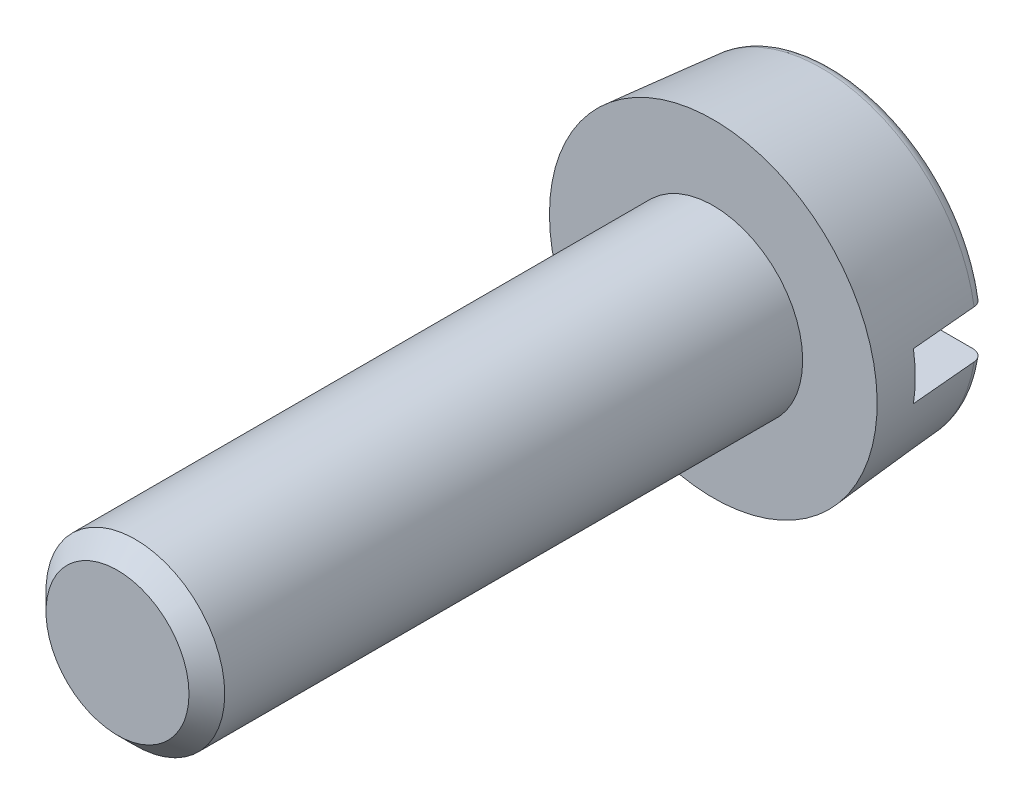
ISO-10303-21;
HEADER;
FILE_DESCRIPTION(('STEP AP214'),'2;1');
FILE_NAME('part.step','',(''),(''),'','','');
FILE_SCHEMA(('AUTOMOTIVE_DESIGN { 1 0 10303 214 1 1 1 1 }'));
ENDSEC;
DATA;
#1=APPLICATION_CONTEXT('core data for automotive mechanical design processes');
#2=APPLICATION_PROTOCOL_DEFINITION('international standard','automotive_design',2000,#1);
#3=PRODUCT_CONTEXT('',#1,'mechanical');
#4=PRODUCT('Part','Part','',(#3));
#5=PRODUCT_RELATED_PRODUCT_CATEGORY('part','',(#4));
#6=PRODUCT_DEFINITION_FORMATION('','',#4);
#7=PRODUCT_DEFINITION_CONTEXT('part definition',#1,'design');
#8=PRODUCT_DEFINITION('design','',#6,#7);
#9=PRODUCT_DEFINITION_SHAPE('','',#8);
#10=(LENGTH_UNIT() NAMED_UNIT(*) SI_UNIT(.MILLI.,.METRE.));
#11=(NAMED_UNIT(*) PLANE_ANGLE_UNIT() SI_UNIT($,.RADIAN.));
#12=(NAMED_UNIT(*) SI_UNIT($,.STERADIAN.) SOLID_ANGLE_UNIT());
#13=UNCERTAINTY_MEASURE_WITH_UNIT(LENGTH_MEASURE(1.E-05),#10,'distance_accuracy_value','');
#14=(GEOMETRIC_REPRESENTATION_CONTEXT(3) GLOBAL_UNCERTAINTY_ASSIGNED_CONTEXT((#13)) GLOBAL_UNIT_ASSIGNED_CONTEXT((#10,
#11,#12)) REPRESENTATION_CONTEXT('',''));
#15=CARTESIAN_POINT('',(0.,0.,0.));
#16=DIRECTION('',(0.,0.,1.));
#17=DIRECTION('',(1.,0.,0.));
#18=AXIS2_PLACEMENT_3D('',#15,#16,#17);
#19=CARTESIAN_POINT('',(0.,0.,-2.));
#20=DIRECTION('',(0.,0.,1.));
#21=DIRECTION('',(1.,0.,0.));
#22=AXIS2_PLACEMENT_3D('',#19,#20,#21);
#23=PLANE('',#22);
#24=DIRECTION('',(1.,0.,0.));
#25=VECTOR('',#24,1.);
#26=CARTESIAN_POINT('',(-2.75,-0.4,-2.));
#27=LINE('',#26,#25);
#28=CARTESIAN_POINT('',(-2.35807100389417,-0.4,-2.));
#29=VERTEX_POINT('',#28);
#30=CARTESIAN_POINT('',(2.35807100389417,-0.4,-2.));
#31=VERTEX_POINT('',#30);
#32=EDGE_CURVE('E179',#29,#31,#27,.T.);
#33=ORIENTED_EDGE('',*,*,#32,.T.);
#34=CARTESIAN_POINT('',(0.,0.,-2.));
#35=DIRECTION('',(0.,0.,-1.));
#36=DIRECTION('',(-1.,0.,0.));
#37=AXIS2_PLACEMENT_3D('',#34,#35,#36);
#38=CIRCLE('',#37,2.39175643814467);
#39=EDGE_CURVE('E111',#31,#29,#38,.T.);
#40=ORIENTED_EDGE('',*,*,#39,.T.);
#41=EDGE_LOOP('',(#33,#40));
#42=FACE_BOUND('',#41,.T.);
#43=ADVANCED_FACE('F30',(#42),#23,.F.);
#44=DIRECTION('',(-1.,0.,0.));
#45=VECTOR('',#44,1.);
#46=CARTESIAN_POINT('',(-2.75,0.4,-2.));
#47=LINE('',#46,#45);
#48=CARTESIAN_POINT('',(2.35807100389417,0.4,-2.));
#49=VERTEX_POINT('',#48);
#50=CARTESIAN_POINT('',(-2.35807100389417,0.4,-2.));
#51=VERTEX_POINT('',#50);
#52=EDGE_CURVE('E96',#49,#51,#47,.T.);
#53=ORIENTED_EDGE('',*,*,#52,.T.);
#54=EDGE_CURVE('E108',#51,#49,#38,.T.);
#55=ORIENTED_EDGE('',*,*,#54,.T.);
#56=EDGE_LOOP('',(#53,#55));
#57=FACE_BOUND('',#56,.T.);
#58=ADVANCED_FACE('F173',(#57),#23,.F.);
#59=CARTESIAN_POINT('',(0.,0.,-1.8));
#60=DIRECTION('',(0.,0.,-1.));
#61=DIRECTION('',(-1.,0.,0.));
#62=AXIS2_PLACEMENT_3D('',#59,#60,#61);
#63=TOROIDAL_SURFACE('',#62,2.39175643814467,0.200000000000001);
#64=CARTESIAN_POINT('',(-2.52204813185839,-0.4,-1.91754116486601));
#65=CARTESIAN_POINT('',(-2.52865775890514,-0.4,-1.90855344162095));
#66=CARTESIAN_POINT('',(-2.53451810160674,-0.4,-1.89900530046316));
#67=CARTESIAN_POINT('',(-2.54455984275685,-0.4,-1.879054234523));
#68=CARTESIAN_POINT('',(-2.54873943790926,-0.4,-1.86865040599647));
#69=CARTESIAN_POINT('',(-2.55528754435603,-0.4,-1.84728807143898));
#70=CARTESIAN_POINT('',(-2.55765633550847,-0.4,-1.83632965139886));
#71=CARTESIAN_POINT('',(-2.56051050201393,-0.4,-1.81417286827281));
#72=CARTESIAN_POINT('',(-2.56099631791475,-0.4,-1.80297456192815));
#73=CARTESIAN_POINT('',(-2.56007317871069,-0.4,-1.78070501289132));
#74=CARTESIAN_POINT('',(-2.55867240657824,-0.4,-1.76963343016532));
#75=CARTESIAN_POINT('',(-2.55403281847354,-0.4,-1.74788225633687));
#76=CARTESIAN_POINT('',(-2.5507939554008,-0.4,-1.73720267528681));
#77=CARTESIAN_POINT('',(-2.54257296593889,-0.4,-1.71652996254586));
#78=CARTESIAN_POINT('',(-2.53758979082597,-0.4,-1.70653724814993));
#79=CARTESIAN_POINT('',(-2.52602836206606,-0.4,-1.68752204377932));
#80=CARTESIAN_POINT('',(-2.51945006472148,-0.4,-1.67849958039396));
#81=CARTESIAN_POINT('',(-2.50483555924673,-0.4,-1.6616069051437));
#82=CARTESIAN_POINT('',(-2.49678887455698,-0.4,-1.65374575962527));
#83=CARTESIAN_POINT('',(-2.47950341410387,-0.4,-1.63946702273388));
#84=CARTESIAN_POINT('',(-2.47026457222365,-0.4,-1.63304951147886));
#85=CARTESIAN_POINT('',(-2.45074120101458,-0.4,-1.62175902781981));
#86=CARTESIAN_POINT('',(-2.44044563631788,-0.4,-1.6169051390523));
#87=CARTESIAN_POINT('',(-2.4191923144838,-0.4,-1.60897149727182));
#88=CARTESIAN_POINT('',(-2.40823451242438,-0.4,-1.60589186476291));
#89=CARTESIAN_POINT('',(-2.38582753572817,-0.4,-1.60155798712168));
#90=CARTESIAN_POINT('',(-2.37437405331689,-0.4,-1.60032600072377));
#91=CARTESIAN_POINT('',(-2.35142171216814,-0.4,-1.59978725729211));
#92=CARTESIAN_POINT('',(-2.33992285111357,-0.4,-1.60048059987327));
#93=CARTESIAN_POINT('',(-2.31711871792309,-0.4,-1.60378458593551));
#94=CARTESIAN_POINT('',(-2.30581544239984,-0.4,-1.60640903344652));
#95=CARTESIAN_POINT('',(-2.28381048661826,-0.4,-1.61352076771892));
#96=CARTESIAN_POINT('',(-2.27310881239486,-0.4,-1.61800807316365));
#97=CARTESIAN_POINT('',(-2.25263145108845,-0.4,-1.62871787324017));
#98=CARTESIAN_POINT('',(-2.24285443091869,-0.4,-1.63493781719781));
#99=CARTESIAN_POINT('',(-2.22449793490009,-0.4,-1.64894755269323));
#100=CARTESIAN_POINT('',(-2.21591840028723,-0.4,-1.65673726715201));
#101=CARTESIAN_POINT('',(-2.20030322071626,-0.4,-1.6735788600478));
#102=CARTESIAN_POINT('',(-2.19325192299053,-0.4,-1.68261622012687));
#103=CARTESIAN_POINT('',(-2.18079547364819,-0.4,-1.70176218098242));
#104=CARTESIAN_POINT('',(-2.17539017097947,-0.4,-1.71187068334591));
#105=CARTESIAN_POINT('',(-2.1664690938285,-0.4,-1.73270099567748));
#106=CARTESIAN_POINT('',(-2.16292487816789,-0.4,-1.74341062660618));
#107=CARTESIAN_POINT('',(-2.15771089941273,-0.4,-1.76527672253501));
#108=CARTESIAN_POINT('',(-2.15604097867979,-0.4,-1.77643314987539));
#109=CARTESIAN_POINT('',(-2.15463824669613,-0.4,-1.79872411828803));
#110=CARTESIAN_POINT('',(-2.15488106401967,-0.4,-1.80985713244257));
#111=CARTESIAN_POINT('',(-2.15723810468913,-0.4,-1.83192290746165));
#112=CARTESIAN_POINT('',(-2.1593522731258,-0.4,-1.84285567419225));
#113=CARTESIAN_POINT('',(-2.16537723833754,-0.4,-1.8641820194607));
#114=CARTESIAN_POINT('',(-2.16928319744312,-0.4,-1.87457696649836));
#115=CARTESIAN_POINT('',(-2.17877018628115,-0.4,-1.89457162214626));
#116=CARTESIAN_POINT('',(-2.18435127178943,-0.4,-1.90417130426341));
#117=CARTESIAN_POINT('',(-2.19707738847665,-0.4,-1.92239559142899));
#118=CARTESIAN_POINT('',(-2.20423561568046,-0.4,-1.9310109772614));
#119=CARTESIAN_POINT('',(-2.21987715075783,-0.4,-1.9469402537394));
#120=CARTESIAN_POINT('',(-2.22836056116485,-0.4,-1.95425404358277));
#121=CARTESIAN_POINT('',(-2.24654950034134,-0.4,-1.96749109107626));
#122=CARTESIAN_POINT('',(-2.25627166684992,-0.4,-1.97339148680604));
#123=CARTESIAN_POINT('',(-2.27655814858367,-0.4,-1.98350262351568));
#124=CARTESIAN_POINT('',(-2.28712253199782,-0.4,-1.98771322751692));
#125=CARTESIAN_POINT('',(-2.30895280047345,-0.4,-1.99438290790571));
#126=CARTESIAN_POINT('',(-2.32022643857178,-0.4,-1.99681662549374));
#127=CARTESIAN_POINT('',(-2.34302147767776,-0.4,-1.99977047768632));
#128=CARTESIAN_POINT('',(-2.35454288099767,-0.4,-2.00029059442448));
#129=CARTESIAN_POINT('',(-2.37758492986869,-0.4,-1.9993987641218));
#130=CARTESIAN_POINT('',(-2.38910509934491,-0.4,-1.99797443961617));
#131=CARTESIAN_POINT('',(-2.41174453190155,-0.4,-1.99320565553102));
#132=CARTESIAN_POINT('',(-2.42286369691932,-0.4,-1.9898607296215));
#133=CARTESIAN_POINT('',(-2.44434826142107,-0.4,-1.98134934163125));
#134=CARTESIAN_POINT('',(-2.45471549647035,-0.4,-1.97618750868627));
#135=CARTESIAN_POINT('',(-2.47441436917435,-0.4,-1.96418230324248));
#136=CARTESIAN_POINT('',(-2.48374728372421,-0.4,-1.95734103837937));
#137=CARTESIAN_POINT('',(-2.49792816294363,-0.4,-1.94494861711723));
#138=CARTESIAN_POINT('',(-2.50316886112467,-0.4,-1.93983942246067));
#139=CARTESIAN_POINT('',(-2.51306301770568,-0.4,-1.92908076915241));
#140=CARTESIAN_POINT('',(-2.51771647990158,-0.4,-1.9234313139934));
#141=CARTESIAN_POINT('',(-2.52204813185839,-0.4,-1.91754116486601));
#142=B_SPLINE_CURVE_WITH_KNOTS('',3,(#64,#65,#66,#67,#68,#69,#70,#71,#72,#73,#74,#75,#76,#77,
#78,#79,#80,#81,#82,#83,#84,#85,#86,#87,#88,#89,#90,#91,#92,#93,#94,#95,#96,#97,#98,#99,#100,
#101,#102,#103,#104,#105,#106,#107,#108,#109,#110,#111,#112,#113,#114,#115,#116,#117,#118,#119,
#120,#121,#122,#123,#124,#125,#126,#127,#128,#129,#130,#131,#132,#133,#134,#135,#136,#137,#138,
#139,#140,#141),.UNSPECIFIED.,.T.,.F.,(4,2,2,2,2,2,2,2,2,2,2,2,2,2,2,2,2,2,2,2,2,2,2,2,2,2,2,2,
2,2,2,2,2,2,2,2,2,2,4),(0.,0.0334429545096416,0.0669216952789984,0.10039526089318,
0.133860994436045,0.167182038682097,0.200503936808105,0.233845903395464,0.267188783472986,
0.300779583457367,0.334372247183692,0.368360601210156,0.402351263388158,0.436748213785953,
0.471146943886305,0.505793983405884,0.540441370422894,0.575038019009378,0.609632969242375,
0.643854816583605,0.678073522456615,0.711752846575423,0.745429337867862,0.778677436042426,
0.811924558682413,0.845082440733007,0.878241426947074,0.91168917055622,0.945139503402407,
0.979099028957501,1.01306130679837,1.04749927697709,1.08193756868627,1.11659610474999,
1.15126305961094,1.18584232143156,1.2203784072163,1.24229555545702,1.26421256201712),.UNSPECIFIED.);
#143=CARTESIAN_POINT('',(-2.55993301623099,-0.4,-1.81743114854954));
#144=VERTEX_POINT('',#143);
#145=EDGE_CURVE('E53',#29,#144,#142,.T.);
#146=ORIENTED_EDGE('',*,*,#145,.F.);
#147=ORIENTED_EDGE('',*,*,#39,.F.);
#148=CARTESIAN_POINT('',(2.18717730075748,-0.4,-1.90804652354134));
#149=CARTESIAN_POINT('',(2.18110315241496,-0.4,-1.89873838847626));
#150=CARTESIAN_POINT('',(2.17580357001095,-0.4,-1.88891600644004));
#151=CARTESIAN_POINT('',(2.16692088779756,-0.4,-1.86851466418179));
#152=CARTESIAN_POINT('',(2.16333954532493,-0.4,-1.85793494203818));
#153=CARTESIAN_POINT('',(2.15801039996166,-0.4,-1.8363224717543));
#154=CARTESIAN_POINT('',(2.1562625197682,-0.4,-1.82528974273418));
#155=CARTESIAN_POINT('',(2.15465660613355,-0.4,-1.80309017837649));
#156=CARTESIAN_POINT('',(2.15479813567302,-0.4,-1.7919233746473));
#157=CARTESIAN_POINT('',(2.15695904857834,-0.4,-1.76983688397364));
#158=CARTESIAN_POINT('',(2.1589678464064,-0.4,-1.75891615915086));
#159=CARTESIAN_POINT('',(2.16478531370035,-0.4,-1.73756521072135));
#160=CARTESIAN_POINT('',(2.1685940461496,-0.4,-1.7271350042929));
#161=CARTESIAN_POINT('',(2.17790806668268,-0.4,-1.70702503197408));
#162=CARTESIAN_POINT('',(2.18341832180526,-0.4,-1.69734756839453));
#163=CARTESIAN_POINT('',(2.19596600203604,-0.4,-1.67903978736831));
#164=CARTESIAN_POINT('',(2.20300351298714,-0.4,-1.67040952882473));
#165=CARTESIAN_POINT('',(2.21849903965848,-0.4,-1.65432219090257));
#166=CARTESIAN_POINT('',(2.22697393571723,-0.4,-1.6468813748568));
#167=CARTESIAN_POINT('',(2.24503616798958,-0.4,-1.63350182437235));
#168=CARTESIAN_POINT('',(2.25462359402434,-0.4,-1.62756321133871));
#169=CARTESIAN_POINT('',(2.27479959262374,-0.4,-1.61726041257125));
#170=CARTESIAN_POINT('',(2.28540145492014,-0.4,-1.61292224576397));
#171=CARTESIAN_POINT('',(2.30717816413856,-0.4,-1.60606525623088));
#172=CARTESIAN_POINT('',(2.31835305044363,-0.4,-1.60354655873434));
#173=CARTESIAN_POINT('',(2.34109050912928,-0.4,-1.60037733963694));
#174=CARTESIAN_POINT('',(2.35265599423713,-0.4,-1.59974767736812));
#175=CARTESIAN_POINT('',(2.37572933267237,-0.4,-1.60043451013051));
#176=CARTESIAN_POINT('',(2.38723718460019,-0.4,-1.60175105219552));
#177=CARTESIAN_POINT('',(2.40989102815518,-0.4,-1.60630294524964));
#178=CARTESIAN_POINT('',(2.42103626360033,-0.4,-1.60954206486822));
#179=CARTESIAN_POINT('',(2.44261892957153,-0.4,-1.617858256736));
#180=CARTESIAN_POINT('',(2.45305637882891,-0.4,-1.62293528032314));
#181=CARTESIAN_POINT('',(2.47284759076734,-0.4,-1.63474969766318));
#182=CARTESIAN_POINT('',(2.48220833389005,-0.4,-1.64147539327146));
#183=CARTESIAN_POINT('',(2.49965030693992,-0.4,-1.65642048563588));
#184=CARTESIAN_POINT('',(2.50773161642923,-0.4,-1.66463978944303));
#185=CARTESIAN_POINT('',(2.52228131526551,-0.4,-1.6822337694238));
#186=CARTESIAN_POINT('',(2.52876786803985,-0.4,-1.69159342414437));
#187=CARTESIAN_POINT('',(2.54005527036093,-0.4,-1.71127937867176));
#188=CARTESIAN_POINT('',(2.54485623677749,-0.4,-1.72160561139816));
#189=CARTESIAN_POINT('',(2.55257807693,-0.4,-1.7427990344163));
#190=CARTESIAN_POINT('',(2.55552066264169,-0.4,-1.75365831666568));
#191=CARTESIAN_POINT('',(2.55952568649073,-0.4,-1.77571812286725));
#192=CARTESIAN_POINT('',(2.56058821862877,-0.4,-1.78691862973009));
#193=CARTESIAN_POINT('',(2.56079987523946,-0.4,-1.80925415852824));
#194=CARTESIAN_POINT('',(2.55996314901748,-0.4,-1.82038904915402));
#195=CARTESIAN_POINT('',(2.55643093039639,-0.4,-1.84235974633734));
#196=CARTESIAN_POINT('',(2.55373546419996,-0.4,-1.85319555710879));
#197=CARTESIAN_POINT('',(2.54656885428999,-0.4,-1.87425674850646));
#198=CARTESIAN_POINT('',(2.54209858627118,-0.4,-1.88448242731654));
#199=CARTESIAN_POINT('',(2.53151544883561,-0.4,-1.90404476742052));
#200=CARTESIAN_POINT('',(2.5254025420446,-0.4,-1.91338140848));
#201=CARTESIAN_POINT('',(2.51166816565575,-0.4,-1.93096815257284));
#202=CARTESIAN_POINT('',(2.50403712511296,-0.4,-1.9392107787209));
#203=CARTESIAN_POINT('',(2.48751338342941,-0.4,-1.95431545517043));
#204=CARTESIAN_POINT('',(2.47862061211541,-0.4,-1.96117742863328));
#205=CARTESIAN_POINT('',(2.45971865614115,-0.4,-1.97341009024931));
#206=CARTESIAN_POINT('',(2.44969793983799,-0.4,-1.97876295763824));
#207=CARTESIAN_POINT('',(2.42890797065678,-0.4,-1.98773369943497));
#208=CARTESIAN_POINT('',(2.41813866637701,-0.4,-1.99135145456645));
#209=CARTESIAN_POINT('',(2.39601590038036,-0.4,-1.99679403945477));
#210=CARTESIAN_POINT('',(2.38465689693969,-0.4,-1.99859635203525));
#211=CARTESIAN_POINT('',(2.36179762454696,-0.4,-2.00028544969931));
#212=CARTESIAN_POINT('',(2.35029735304536,-0.4,-2.000172200161));
#213=CARTESIAN_POINT('',(2.32738256886445,-0.4,-1.99802672405231));
#214=CARTESIAN_POINT('',(2.31596951263907,-0.4,-1.99597890999401));
#215=CARTESIAN_POINT('',(2.29364561676425,-0.4,-1.98999589027034));
#216=CARTESIAN_POINT('',(2.28273490969166,-0.4,-1.98606018945955));
#217=CARTESIAN_POINT('',(2.26172806482548,-0.4,-1.97640485433136));
#218=CARTESIAN_POINT('',(2.25163230835283,-0.4,-1.97068439093204));
#219=CARTESIAN_POINT('',(2.23256593586261,-0.4,-1.95761777492515));
#220=CARTESIAN_POINT('',(2.22359394654305,-0.4,-1.95027363750458));
#221=CARTESIAN_POINT('',(2.21001843234669,-0.4,-1.93706652506876));
#222=CARTESIAN_POINT('',(2.20500360940041,-0.4,-1.93161954175565));
#223=CARTESIAN_POINT('',(2.19560397269714,-0.4,-1.92020644428171));
#224=CARTESIAN_POINT('',(2.19121915461504,-0.4,-1.91424033368525));
#225=CARTESIAN_POINT('',(2.18717730075748,-0.4,-1.90804652354134));
#226=B_SPLINE_CURVE_WITH_KNOTS('',3,(#148,#149,#150,#151,#152,#153,#154,#155,#156,#157,#158,
#159,#160,#161,#162,#163,#164,#165,#166,#167,#168,#169,#170,#171,#172,#173,#174,#175,#176,#177,
#178,#179,#180,#181,#182,#183,#184,#185,#186,#187,#188,#189,#190,#191,#192,#193,#194,#195,#196,
#197,#198,#199,#200,#201,#202,#203,#204,#205,#206,#207,#208,#209,#210,#211,#212,#213,#214,#215,
#216,#217,#218,#219,#220,#221,#222,#223,#224,#225),.UNSPECIFIED.,.T.,.F.,(4,2,2,2,2,2,2,2,2,2,2,
2,2,2,2,2,2,2,2,2,2,2,2,2,2,2,2,2,2,2,2,2,2,2,2,2,2,2,4),(0.,0.0333175371590637,
0.066669077703598,0.100019212016876,0.133361632597528,0.166516180391959,0.199671888416952,
0.232925313589903,0.266180608332128,0.299857576086579,0.333537264677462,0.367742598321551,
0.40195028600424,0.43653434067295,0.471119231146039,0.505772139727291,0.540424130872691,
0.574837025814776,0.609247779934873,0.643246281659973,0.677242425639566,0.710833654753138,
0.744423204292979,0.777763336708819,0.811102999138115,0.844426232039714,0.87775022319465,
0.911291369639244,0.944834382261553,0.978758325969731,1.0126846013673,1.0470266710953,
1.08136936152295,1.11599114499098,1.15062201385459,1.18526899392752,1.21987321168988,
1.24204348693625,1.26421360997197),.UNSPECIFIED.);
#227=CARTESIAN_POINT('',(2.55993301623096,-0.4,-1.81743114854953));
#228=VERTEX_POINT('',#227);
#229=EDGE_CURVE('E129',#228,#31,#226,.T.);
#230=ORIENTED_EDGE('',*,*,#229,.F.);
#231=CARTESIAN_POINT('',(0.,0.,-1.81743114854953));
#232=DIRECTION('',(0.,0.,-1.));
#233=DIRECTION('',(-1.,0.,0.));
#234=AXIS2_PLACEMENT_3D('',#231,#232,#233);
#235=CIRCLE('',#234,2.59099537776302);
#236=EDGE_CURVE('E120',#228,#144,#235,.T.);
#237=ORIENTED_EDGE('',*,*,#236,.T.);
#238=EDGE_LOOP('',(#146,#147,#230,#237));
#239=FACE_BOUND('',#238,.T.);
#240=ADVANCED_FACE('F133',(#239),#63,.T.);
#241=CARTESIAN_POINT('',(-2.52204813185839,0.4,-1.91754116486601));
#242=CARTESIAN_POINT('',(-2.51532842039504,0.4,-1.92667685695518));
#243=CARTESIAN_POINT('',(-2.5078244918626,0.4,-1.93524678290179));
#244=CARTESIAN_POINT('',(-2.49147357681421,0.4,-1.95100742039314));
#245=CARTESIAN_POINT('',(-2.48262479440265,0.4,-1.95819625815028));
#246=CARTESIAN_POINT('',(-2.4638575551847,0.4,-1.97098457564015));
#247=CARTESIAN_POINT('',(-2.45394019283428,0.4,-1.97658566061528));
#248=CARTESIAN_POINT('',(-2.43331557360162,0.4,-1.98605896397189));
#249=CARTESIAN_POINT('',(-2.42260851251218,0.4,-1.98993160922369));
#250=CARTESIAN_POINT('',(-2.40060033591019,0.4,-1.99587974689121));
#251=CARTESIAN_POINT('',(-2.38929465598077,0.4,-1.99793835247857));
#252=CARTESIAN_POINT('',(-2.3664977371402,0.4,-2.0001463909628));
#253=CARTESIAN_POINT('',(-2.35500647986667,0.4,-2.00029563376003));
#254=CARTESIAN_POINT('',(-2.33205954438959,0.4,-1.99867602558952));
#255=CARTESIAN_POINT('',(-2.32060503545202,0.4,-1.99689055799782));
#256=CARTESIAN_POINT('',(-2.29815739998696,0.4,-1.99142359305903));
#257=CARTESIAN_POINT('',(-2.28716428249501,0.4,-1.98774205859948));
#258=CARTESIAN_POINT('',(-2.26594728985822,0.4,-1.97857791101613));
#259=CARTESIAN_POINT('',(-2.25572391282753,0.4,-1.97309414373725));
#260=CARTESIAN_POINT('',(-2.23635374674797,0.4,-1.960473449738));
#261=CARTESIAN_POINT('',(-2.22720691653361,0.4,-1.9533365862605));
#262=CARTESIAN_POINT('',(-2.21034116554166,0.4,-1.93767624032218));
#263=CARTESIAN_POINT('',(-2.20261021210701,0.4,-1.9291657224764));
#264=CARTESIAN_POINT('',(-2.1887134873309,0.4,-1.91095023041545));
#265=CARTESIAN_POINT('',(-2.18254758332622,0.4,-1.90124535754478));
#266=CARTESIAN_POINT('',(-2.17205707401491,0.4,-1.88107531563813));
#267=CARTESIAN_POINT('',(-2.16770576045591,0.4,-1.87062403799987));
#268=CARTESIAN_POINT('',(-2.1608481171854,0.4,-1.84913282955872));
#269=CARTESIAN_POINT('',(-2.15834161959073,0.4,-1.83809295241804));
#270=CARTESIAN_POINT('',(-2.15527621325712,0.4,-1.81590519736191));
#271=CARTESIAN_POINT('',(-2.15469033016275,0.4,-1.8047610397029));
#272=CARTESIAN_POINT('',(-2.15540879944578,0.4,-1.78253414214427));
#273=CARTESIAN_POINT('',(-2.1567130692157,0.4,-1.7714513995818));
#274=CARTESIAN_POINT('',(-2.16115853094479,0.4,-1.7497217674004));
#275=CARTESIAN_POINT('',(-2.16429007516799,0.4,-1.73907290055877));
#276=CARTESIAN_POINT('',(-2.17228532985241,0.4,-1.71844704884717));
#277=CARTESIAN_POINT('',(-2.17714907731867,0.4,-1.70847007833633));
#278=CARTESIAN_POINT('',(-2.18849845840415,0.4,-1.68939885053504));
#279=CARTESIAN_POINT('',(-2.19499435347906,0.4,-1.68031070352053));
#280=CARTESIAN_POINT('',(-2.20939956391024,0.4,-1.66333415556471));
#281=CARTESIAN_POINT('',(-2.2173089776295,0.4,-1.65544583818711));
#282=CARTESIAN_POINT('',(-2.23443778435572,0.4,-1.64097052110721));
#283=CARTESIAN_POINT('',(-2.24367443733959,0.4,-1.6344039474938));
#284=CARTESIAN_POINT('',(-2.26310595833029,0.4,-1.6228877872429));
#285=CARTESIAN_POINT('',(-2.27330090454396,0.4,-1.61793833272719));
#286=CARTESIAN_POINT('',(-2.29452316646588,0.4,-1.60972244694775));
#287=CARTESIAN_POINT('',(-2.30556062282356,0.4,-1.60648219752978));
#288=CARTESIAN_POINT('',(-2.32802096609934,0.4,-1.60188312061812));
#289=CARTESIAN_POINT('',(-2.33944387503777,0.4,-1.60052440080046));
#290=CARTESIAN_POINT('',(-2.36245419957867,0.4,-1.59972216172707));
#291=CARTESIAN_POINT('',(-2.37404218890753,0.4,-1.60029497205457));
#292=CARTESIAN_POINT('',(-2.39695749356758,0.4,-1.60337957443683));
#293=CARTESIAN_POINT('',(-2.40828480700454,0.4,-1.60589138057692));
#294=CARTESIAN_POINT('',(-2.43034286768424,0.4,-1.61278651457658));
#295=CARTESIAN_POINT('',(-2.44107419782763,0.4,-1.61716797604743));
#296=CARTESIAN_POINT('',(-2.46163950233393,0.4,-1.62768622897981));
#297=CARTESIAN_POINT('',(-2.47147351093021,0.4,-1.63382295343998));
#298=CARTESIAN_POINT('',(-2.48986827020729,0.4,-1.64762128615837));
#299=CARTESIAN_POINT('',(-2.49843966844565,0.4,-1.65526869607198));
#300=CARTESIAN_POINT('',(-2.51415677651813,0.4,-1.6719103374321));
#301=CARTESIAN_POINT('',(-2.52130258001157,0.4,-1.68090448033238));
#302=CARTESIAN_POINT('',(-2.53387076151727,0.4,-1.69986368760844));
#303=CARTESIAN_POINT('',(-2.53931355026688,0.4,-1.70981522216583));
#304=CARTESIAN_POINT('',(-2.54842960889365,0.4,-1.73049777835154));
#305=CARTESIAN_POINT('',(-2.55210306638803,0.4,-1.74122871719406));
#306=CARTESIAN_POINT('',(-2.55753736540159,0.4,-1.76303837809947));
#307=CARTESIAN_POINT('',(-2.55931885044305,0.4,-1.77411196040169));
#308=CARTESIAN_POINT('',(-2.56098644505497,0.4,-1.79640389607271));
#309=CARTESIAN_POINT('',(-2.56087214702274,0.4,-1.80762228005648));
#310=CARTESIAN_POINT('',(-2.55875670231456,0.4,-1.82982215155742));
#311=CARTESIAN_POINT('',(-2.55676490168163,0.4,-1.84080453705633));
#312=CARTESIAN_POINT('',(-2.55096892251001,0.4,-1.86226996635356));
#313=CARTESIAN_POINT('',(-2.54716698146127,0.4,-1.8727536090918));
#314=CARTESIAN_POINT('',(-2.53970639854014,0.4,-1.88895085332816));
#315=CARTESIAN_POINT('',(-2.53658157462096,0.4,-1.89491631475895));
#316=CARTESIAN_POINT('',(-2.52974589661504,0.4,-1.90650129220064));
#317=CARTESIAN_POINT('',(-2.52603504592316,0.4,-1.91212081021532));
#318=CARTESIAN_POINT('',(-2.52204813185839,0.4,-1.91754116486601));
#319=B_SPLINE_CURVE_WITH_KNOTS('',3,(#241,#242,#243,#244,#245,#246,#247,#248,#249,#250,#251,
#252,#253,#254,#255,#256,#257,#258,#259,#260,#261,#262,#263,#264,#265,#266,#267,#268,#269,#270,
#271,#272,#273,#274,#275,#276,#277,#278,#279,#280,#281,#282,#283,#284,#285,#286,#287,#288,#289,
#290,#291,#292,#293,#294,#295,#296,#297,#298,#299,#300,#301,#302,#303,#304,#305,#306,#307,#308,
#309,#310,#311,#312,#313,#314,#315,#316,#317,#318),.UNSPECIFIED.,.T.,.F.,(4,2,2,2,2,2,2,2,2,2,2,
2,2,2,2,2,2,2,2,2,2,2,2,2,2,2,2,2,2,2,2,2,2,2,2,2,2,2,4),(0.,0.033997672898568,
0.0680411512437832,0.102050087345677,0.136050619654504,0.170364416183181,0.2046816290292,
0.239295934946022,0.273910918408038,0.308548112741691,0.343183982171666,0.377510256393796,
0.411833619937311,0.44563225639051,0.47942781669757,0.512746649484213,0.546064026144085,
0.57920706367244,0.612350809277732,0.645708388036224,0.679068288964118,0.712909693932236,
0.746753863118152,0.781102420819385,0.815452944136029,0.850094599968769,0.884736507449045,
0.919343914149215,0.953950000002487,0.988245111137209,1.0225379683947,1.05640251010354,
1.09026346007651,1.12375102943994,1.15724579888918,1.1905747099453,1.22386253012412,
1.24403401906064,1.26420539114825),.UNSPECIFIED.);
#320=CARTESIAN_POINT('',(-2.55993301623096,0.4,-1.81743114854953));
#321=VERTEX_POINT('',#320);
#322=EDGE_CURVE('E185',#321,#51,#319,.T.);
#323=ORIENTED_EDGE('',*,*,#322,.F.);
#324=CARTESIAN_POINT('',(2.55993301623099,0.4,-1.81743114854954));
#325=VERTEX_POINT('',#324);
#326=EDGE_CURVE('E116',#321,#325,#235,.T.);
#327=ORIENTED_EDGE('',*,*,#326,.T.);
#328=CARTESIAN_POINT('',(2.18717730075748,0.4,-1.90804652354134));
#329=CARTESIAN_POINT('',(2.1933845285355,0.4,-1.91755672981261));
#330=CARTESIAN_POINT('',(2.20040965990868,0.4,-1.92654394523578));
#331=CARTESIAN_POINT('',(2.21588045501963,0.4,-1.94321371003312));
#332=CARTESIAN_POINT('',(2.22432808874997,0.4,-1.95089441999047));
#333=CARTESIAN_POINT('',(2.24237933852113,0.4,-1.96472697555471));
#334=CARTESIAN_POINT('',(2.25198164414811,0.4,-1.97088053043823));
#335=CARTESIAN_POINT('',(2.27207120764008,0.4,-1.98150606837344));
#336=CARTESIAN_POINT('',(2.28255824037136,0.4,-1.98597847765006));
#337=CARTESIAN_POINT('',(2.30424211140138,0.4,-1.99316723741072));
#338=CARTESIAN_POINT('',(2.31544531698425,0.4,-1.99586438879418));
#339=CARTESIAN_POINT('',(2.33814523902648,0.4,-1.99935476714846));
#340=CARTESIAN_POINT('',(2.34964198313332,0.4,-2.00014781410414));
#341=CARTESIAN_POINT('',(2.37268955895822,0.4,-1.99980564096623));
#342=CARTESIAN_POINT('',(2.38424018892481,0.4,-1.9986565802962));
#343=CARTESIAN_POINT('',(2.40698372609588,0.4,-1.99443116680097));
#344=CARTESIAN_POINT('',(2.41817663371006,0.4,-1.99135481618323));
#345=CARTESIAN_POINT('',(2.43985624751309,0.4,-1.9833638646325));
#346=CARTESIAN_POINT('',(2.45034456029606,0.4,-1.97845362562342));
#347=CARTESIAN_POINT('',(2.47033664125133,0.4,-1.96692517271308));
#348=CARTESIAN_POINT('',(2.4798404567889,0.4,-1.96030704103399));
#349=CARTESIAN_POINT('',(2.49749196329481,0.4,-1.94561806863897));
#350=CARTESIAN_POINT('',(2.50565206314577,0.4,-1.93756214284685));
#351=CARTESIAN_POINT('',(2.52048289044759,0.4,-1.92017929871766));
#352=CARTESIAN_POINT('',(2.52715371903534,0.4,-1.91085246675756));
#353=CARTESIAN_POINT('',(2.53872798675577,0.4,-1.89131877232308));
#354=CARTESIAN_POINT('',(2.54365260995871,0.4,-1.88112446085344));
#355=CARTESIAN_POINT('',(2.55170003919163,0.4,-1.86004787463557));
#356=CARTESIAN_POINT('',(2.55482296005016,0.4,-1.84916564377981));
#357=CARTESIAN_POINT('',(2.55914827593437,0.4,-1.82714281367531));
#358=CARTESIAN_POINT('',(2.56037013904266,0.4,-1.81600603479138));
#359=CARTESIAN_POINT('',(2.56091761385502,0.4,-1.79368614161478));
#360=CARTESIAN_POINT('',(2.56024329143199,0.4,-1.7825030289452));
#361=CARTESIAN_POINT('',(2.55702628563931,0.4,-1.7604597769002));
#362=CARTESIAN_POINT('',(2.55449187936319,0.4,-1.74959842777146));
#363=CARTESIAN_POINT('',(2.54764054970065,0.4,-1.7284536108341));
#364=CARTESIAN_POINT('',(2.54332362042397,0.4,-1.71817014493521));
#365=CARTESIAN_POINT('',(2.53302104472277,0.4,-1.69843935134364));
#366=CARTESIAN_POINT('',(2.52703069407634,0.4,-1.68899448116259));
#367=CARTESIAN_POINT('',(2.51356277789799,0.4,-1.67123283012581));
#368=CARTESIAN_POINT('',(2.5060851541428,0.4,-1.66291609345532));
#369=CARTESIAN_POINT('',(2.48978402850672,0.4,-1.64756375463643));
#370=CARTESIAN_POINT('',(2.48094887595559,0.4,-1.64054052605232));
#371=CARTESIAN_POINT('',(2.46223689564347,0.4,-1.62805570692074));
#372=CARTESIAN_POINT('',(2.45236000307186,0.4,-1.62259421361333));
#373=CARTESIAN_POINT('',(2.43171474206137,0.4,-1.61331650913559));
#374=CARTESIAN_POINT('',(2.42093688103658,0.4,-1.6095214208123));
#375=CARTESIAN_POINT('',(2.39890081334873,0.4,-1.603772409542));
#376=CARTESIAN_POINT('',(2.38764257516654,0.4,-1.60181860760269));
#377=CARTESIAN_POINT('',(2.36483269598681,0.4,-1.599788925816));
#378=CARTESIAN_POINT('',(2.35327918880843,0.4,-1.59973398162368));
#379=CARTESIAN_POINT('',(2.33032496711926,0.4,-1.60155421789059));
#380=CARTESIAN_POINT('',(2.31892425887084,0.4,-1.60342947721474));
#381=CARTESIAN_POINT('',(2.29654193848891,0.4,-1.60907358166976));
#382=CARTESIAN_POINT('',(2.28556263978257,0.4,-1.61285161130254));
#383=CARTESIAN_POINT('',(2.26439791511681,0.4,-1.62220520437267));
#384=CARTESIAN_POINT('',(2.25421248480584,0.4,-1.62778075795608));
#385=CARTESIAN_POINT('',(2.23497762428168,0.4,-1.64055052051167));
#386=CARTESIAN_POINT('',(2.22592332189913,0.4,-1.64773738626148));
#387=CARTESIAN_POINT('',(2.20916955877609,0.4,-1.66354744703785));
#388=CARTESIAN_POINT('',(2.2014700113886,0.4,-1.67217055013727));
#389=CARTESIAN_POINT('',(2.18775408720352,0.4,-1.6904904318653));
#390=CARTESIAN_POINT('',(2.18171715464471,0.4,-1.70017181661167));
#391=CARTESIAN_POINT('',(2.17138491718769,0.4,-1.72042279912042));
#392=CARTESIAN_POINT('',(2.16708937544236,0.4,-1.73099227585688));
#393=CARTESIAN_POINT('',(2.16043084179007,0.4,-1.75253948245186));
#394=CARTESIAN_POINT('',(2.15803829106337,0.4,-1.76350808329419));
#395=CARTESIAN_POINT('',(2.15514935070828,0.4,-1.78569514787806));
#396=CARTESIAN_POINT('',(2.15465331335318,0.4,-1.79691365765044));
#397=CARTESIAN_POINT('',(2.15556921073081,0.4,-1.81916169532233));
#398=CARTESIAN_POINT('',(2.15696266708453,0.4,-1.83019200052793));
#399=CARTESIAN_POINT('',(2.1615806690868,0.4,-1.85185229379352));
#400=CARTESIAN_POINT('',(2.16480293376229,0.4,-1.86248276296961));
#401=CARTESIAN_POINT('',(2.17133465474189,0.4,-1.87893094196849));
#402=CARTESIAN_POINT('',(2.17409388193831,0.4,-1.88497317117254));
#403=CARTESIAN_POINT('',(2.18020139290792,0.4,-1.89675198130911));
#404=CARTESIAN_POINT('',(2.18354967051248,0.4,-1.90248856544158));
#405=CARTESIAN_POINT('',(2.18717730075748,0.4,-1.90804652354134));
#406=B_SPLINE_CURVE_WITH_KNOTS('',3,(#328,#329,#330,#331,#332,#333,#334,#335,#336,#337,#338,
#339,#340,#341,#342,#343,#344,#345,#346,#347,#348,#349,#350,#351,#352,#353,#354,#355,#356,#357,
#358,#359,#360,#361,#362,#363,#364,#365,#366,#367,#368,#369,#370,#371,#372,#373,#374,#375,#376,
#377,#378,#379,#380,#381,#382,#383,#384,#385,#386,#387,#388,#389,#390,#391,#392,#393,#394,#395,
#396,#397,#398,#399,#400,#401,#402,#403,#404,#405),.UNSPECIFIED.,.T.,.F.,(4,2,2,2,2,2,2,2,2,2,2,
2,2,2,2,2,2,2,2,2,2,2,2,2,2,2,2,2,2,2,2,2,2,2,2,2,2,2,4),(0.,0.0340452787104374,
0.0681380996991236,0.102192588251598,0.136238437054369,0.170646686613988,0.205058189021588,
0.239715962970444,0.274373697223326,0.308949517278201,0.34352367307816,0.377758067783893,
0.411990136913188,0.445791437942456,0.479590584462886,0.513041272424797,0.546490798334437,
0.579792374468441,0.613094060646885,0.64649032126142,0.679887889519027,0.713589994134101,
0.747294196724185,0.78141408978537,0.815536225019162,0.85003445160595,0.88453408778954,
0.919201869922415,0.953869462011513,0.988382164178566,1.02289265818998,1.05695507965605,
1.09101286672556,1.12453070436746,1.15805476757329,1.1912533344036,1.2244105851782,
1.24430754730919,1.26420430108822),.UNSPECIFIED.);
#407=EDGE_CURVE('E186',#49,#325,#406,.T.);
#408=ORIENTED_EDGE('',*,*,#407,.F.);
#409=ORIENTED_EDGE('',*,*,#54,.F.);
#410=EDGE_LOOP('',(#323,#327,#408,#409));
#411=FACE_BOUND('',#410,.T.);
#412=ADVANCED_FACE('F158',(#411),#63,.T.);
#413=CARTESIAN_POINT('',(0.,0.,0.));
#414=DIRECTION('',(0.,0.,1.));
#415=DIRECTION('',(1.,0.,0.));
#416=AXIS2_PLACEMENT_3D('',#413,#414,#415);
#417=CONICAL_SURFACE('',#416,2.75,0.0872664625997163);
#418=CARTESIAN_POINT('',(0.,0.,0.));
#419=DIRECTION('',(0.,0.,-1.));
#420=DIRECTION('',(-1.,0.,0.));
#421=AXIS2_PLACEMENT_3D('',#418,#419,#420);
#422=CIRCLE('',#421,2.75);
#423=CARTESIAN_POINT('',(-2.75,0.,0.));
#424=VERTEX_POINT('',#423);
#425=EDGE_CURVE('E121',#424,#424,#422,.T.);
#426=ORIENTED_EDGE('',*,*,#425,.T.);
#427=EDGE_LOOP('',(#426));
#428=FACE_BOUND('',#427,.T.);
#429=CARTESIAN_POINT('',(-2.17665154772388,-0.4,-6.13679417698671));
#430=CARTESIAN_POINT('',(-2.29688458486495,-0.4,-4.78501127268338));
#431=CARTESIAN_POINT('',(-2.41682603752144,-0.4,-3.43320249226895));
#432=CARTESIAN_POINT('',(-2.55941857675342,-0.4,-1.82327092364094));
#433=CARTESIAN_POINT('',(-2.5822713820054,-0.4,-1.5651660063847));
#434=CARTESIAN_POINT('',(-2.74761802963455,-0.4,0.30287920115344));
#435=CARTESIAN_POINT('',(-2.88984427565506,-0.4,1.91284318721365));
#436=CARTESIAN_POINT('',(-3.03193476862785,-0.4,3.52281911459642));
#437=B_SPLINE_CURVE_WITH_KNOTS('',3,(#429,#430,#431,#432,#433,#434,#435,#436),.UNSPECIFIED.,.F.,
.F.,(4,2,2,4),(0.,4.07135801908916,4.84870195240369,9.69740384490695),.UNSPECIFIED.);
#438=CARTESIAN_POINT('',(-2.65883794840632,-0.4,-0.7));
#439=VERTEX_POINT('',#438);
#440=EDGE_CURVE('E81',#144,#439,#437,.T.);
#441=ORIENTED_EDGE('',*,*,#440,.F.);
#442=ORIENTED_EDGE('',*,*,#236,.F.);
#443=CARTESIAN_POINT('',(3.03193476862785,-0.4,3.52281911459642));
#444=CARTESIAN_POINT('',(2.96089605445597,-0.4,2.7178305567444));
#445=CARTESIAN_POINT('',(2.88981709739848,-0.4,1.91284554745651));
#446=CARTESIAN_POINT('',(2.74755308776784,-0.4,0.302884928336888));
#447=CARTESIAN_POINT('',(2.6763680351978,-0.4,-0.502090681495115));
#448=CARTESIAN_POINT('',(2.53386621970369,-0.4,-2.11203025710071));
#449=CARTESIAN_POINT('',(2.46254945677788,-0.4,-2.91699422287415));
#450=CARTESIAN_POINT('',(2.31974175238757,-0.4,-4.52690672629523));
#451=CARTESIAN_POINT('',(2.24825081091793,-0.4,-5.33185526394241));
#452=CARTESIAN_POINT('',(2.17665154772388,-0.4,-6.13679417698671));
#453=B_SPLINE_CURVE_WITH_KNOTS('',3,(#443,#444,#445,#446,#447,#448,#449,#450,#451,#452),
.UNSPECIFIED.,.F.,.F.,(4,2,2,2,4),(0.,2.4243509870318,4.84870190303199,7.27305285081886,
9.69740387023481),.UNSPECIFIED.);
#454=CARTESIAN_POINT('',(2.65883794840632,-0.4,-0.7));
#455=VERTEX_POINT('',#454);
#456=EDGE_CURVE('E101',#455,#228,#453,.T.);
#457=ORIENTED_EDGE('',*,*,#456,.F.);
#458=CARTESIAN_POINT('',(0.,0.,-0.7));
#459=DIRECTION('',(0.,0.,1.));
#460=DIRECTION('',(1.,0.,0.));
#461=AXIS2_PLACEMENT_3D('',#458,#459,#460);
#462=CIRCLE('',#461,2.68875793553185);
#463=CARTESIAN_POINT('',(2.65883794840632,0.4,-0.7));
#464=VERTEX_POINT('',#463);
#465=EDGE_CURVE('E95',#455,#464,#462,.T.);
#466=ORIENTED_EDGE('',*,*,#465,.T.);
#467=CARTESIAN_POINT('',(2.17665154772388,0.4,-6.13679417698671));
#468=CARTESIAN_POINT('',(2.29688458486495,0.4,-4.78501127268338));
#469=CARTESIAN_POINT('',(2.41682603752144,0.4,-3.43320249226895));
#470=CARTESIAN_POINT('',(2.55941857675342,0.4,-1.82327092364094));
#471=CARTESIAN_POINT('',(2.5822713820054,0.4,-1.5651660063847));
#472=CARTESIAN_POINT('',(2.74761802963455,0.4,0.30287920115344));
#473=CARTESIAN_POINT('',(2.88984427565506,0.4,1.91284318721365));
#474=CARTESIAN_POINT('',(3.03193476862785,0.4,3.52281911459642));
#475=B_SPLINE_CURVE_WITH_KNOTS('',3,(#467,#468,#469,#470,#471,#472,#473,#474),.UNSPECIFIED.,.F.,
.F.,(4,2,2,4),(0.,4.07135801908916,4.84870195240369,9.69740384490695),.UNSPECIFIED.);
#476=EDGE_CURVE('E104',#325,#464,#475,.T.);
#477=ORIENTED_EDGE('',*,*,#476,.F.);
#478=ORIENTED_EDGE('',*,*,#326,.F.);
#479=CARTESIAN_POINT('',(-3.03193476862785,0.4,3.52281911459642));
#480=CARTESIAN_POINT('',(-2.96089605445597,0.4,2.7178305567444));
#481=CARTESIAN_POINT('',(-2.88981709739848,0.4,1.91284554745651));
#482=CARTESIAN_POINT('',(-2.74755308776784,0.4,0.302884928336888));
#483=CARTESIAN_POINT('',(-2.6763680351978,0.4,-0.502090681495115));
#484=CARTESIAN_POINT('',(-2.53386621970369,0.4,-2.11203025710071));
#485=CARTESIAN_POINT('',(-2.46254945677788,0.4,-2.91699422287415));
#486=CARTESIAN_POINT('',(-2.31974175238757,0.4,-4.52690672629523));
#487=CARTESIAN_POINT('',(-2.24825081091793,0.4,-5.33185526394241));
#488=CARTESIAN_POINT('',(-2.17665154772388,0.4,-6.13679417698671));
#489=B_SPLINE_CURVE_WITH_KNOTS('',3,(#479,#480,#481,#482,#483,#484,#485,#486,#487,#488),
.UNSPECIFIED.,.F.,.F.,(4,2,2,2,4),(0.,2.4243509870318,4.84870190303199,7.27305285081886,
9.69740387023481),.UNSPECIFIED.);
#490=CARTESIAN_POINT('',(-2.65883794840632,0.4,-0.7));
#491=VERTEX_POINT('',#490);
#492=EDGE_CURVE('E90',#491,#321,#489,.T.);
#493=ORIENTED_EDGE('',*,*,#492,.F.);
#494=EDGE_CURVE('E93',#491,#439,#462,.T.);
#495=ORIENTED_EDGE('',*,*,#494,.T.);
#496=EDGE_LOOP('',(#441,#442,#457,#466,#477,#478,#493,#495));
#497=FACE_BOUND('',#496,.T.);
#498=ADVANCED_FACE('F99',(#428,#497),#417,.T.);
#499=CARTESIAN_POINT('',(0.,0.,0.));
#500=DIRECTION('',(0.,0.,-1.));
#501=DIRECTION('',(-1.,0.,0.));
#502=AXIS2_PLACEMENT_3D('',#499,#500,#501);
#503=PLANE('',#502);
#504=CARTESIAN_POINT('',(0.,0.,0.));
#505=DIRECTION('',(0.,0.,1.));
#506=DIRECTION('',(1.,0.,0.));
#507=AXIS2_PLACEMENT_3D('',#504,#505,#506);
#508=CIRCLE('',#507,1.5);
#509=CARTESIAN_POINT('',(1.5,0.,0.));
#510=VERTEX_POINT('',#509);
#511=EDGE_CURVE('E181',#510,#510,#508,.T.);
#512=ORIENTED_EDGE('',*,*,#511,.F.);
#513=EDGE_LOOP('',(#512));
#514=FACE_BOUND('',#513,.T.);
#515=ORIENTED_EDGE('',*,*,#425,.F.);
#516=EDGE_LOOP('',(#515));
#517=FACE_BOUND('',#516,.T.);
#518=ADVANCED_FACE('F141',(#514,#517),#503,.F.);
#519=CARTESIAN_POINT('',(-2.75,-0.4,-0.7));
#520=DIRECTION('',(0.,1.,0.));
#521=DIRECTION('',(0.,0.,1.));
#522=AXIS2_PLACEMENT_3D('',#519,#520,#521);
#523=PLANE('',#522);
#524=ORIENTED_EDGE('',*,*,#145,.T.);
#525=ORIENTED_EDGE('',*,*,#440,.T.);
#526=DIRECTION('',(1.,0.,0.));
#527=VECTOR('',#526,1.);
#528=CARTESIAN_POINT('',(-2.75,-0.4,-0.7));
#529=LINE('',#528,#527);
#530=EDGE_CURVE('E84',#439,#455,#529,.T.);
#531=ORIENTED_EDGE('',*,*,#530,.T.);
#532=ORIENTED_EDGE('',*,*,#456,.T.);
#533=ORIENTED_EDGE('',*,*,#229,.T.);
#534=ORIENTED_EDGE('',*,*,#32,.F.);
#535=EDGE_LOOP('',(#524,#525,#531,#532,#533,#534));
#536=FACE_BOUND('',#535,.T.);
#537=ADVANCED_FACE('F83',(#536),#523,.T.);
#538=CARTESIAN_POINT('',(-2.75,0.4,-0.7));
#539=DIRECTION('',(0.,-1.,0.));
#540=DIRECTION('',(0.,0.,-1.));
#541=AXIS2_PLACEMENT_3D('',#538,#539,#540);
#542=PLANE('',#541);
#543=ORIENTED_EDGE('',*,*,#322,.T.);
#544=ORIENTED_EDGE('',*,*,#52,.F.);
#545=ORIENTED_EDGE('',*,*,#407,.T.);
#546=ORIENTED_EDGE('',*,*,#476,.T.);
#547=DIRECTION('',(-1.,0.,0.));
#548=VECTOR('',#547,1.);
#549=CARTESIAN_POINT('',(-2.75,0.4,-0.7));
#550=LINE('',#549,#548);
#551=EDGE_CURVE('E45',#464,#491,#550,.T.);
#552=ORIENTED_EDGE('',*,*,#551,.T.);
#553=ORIENTED_EDGE('',*,*,#492,.T.);
#554=EDGE_LOOP('',(#543,#544,#545,#546,#552,#553));
#555=FACE_BOUND('',#554,.T.);
#556=ADVANCED_FACE('F140',(#555),#542,.T.);
#557=CARTESIAN_POINT('',(-2.75,-0.4,-0.7));
#558=DIRECTION('',(0.,0.,1.));
#559=DIRECTION('',(1.,0.,0.));
#560=AXIS2_PLACEMENT_3D('',#557,#558,#559);
#561=PLANE('',#560);
#562=ORIENTED_EDGE('',*,*,#551,.F.);
#563=ORIENTED_EDGE('',*,*,#465,.F.);
#564=ORIENTED_EDGE('',*,*,#530,.F.);
#565=ORIENTED_EDGE('',*,*,#494,.F.);
#566=EDGE_LOOP('',(#562,#563,#564,#565));
#567=FACE_BOUND('',#566,.T.);
#568=ADVANCED_FACE('F92',(#567),#561,.F.);
#569=CARTESIAN_POINT('',(0.,0.,10.));
#570=DIRECTION('',(0.,0.,1.));
#571=DIRECTION('',(1.,0.,0.));
#572=AXIS2_PLACEMENT_3D('',#569,#570,#571);
#573=PLANE('',#572);
#574=CARTESIAN_POINT('',(0.,0.,10.));
#575=DIRECTION('',(0.,0.,1.));
#576=DIRECTION('',(1.,0.,0.));
#577=AXIS2_PLACEMENT_3D('',#574,#575,#576);
#578=CIRCLE('',#577,1.2);
#579=CARTESIAN_POINT('',(1.2,0.,10.));
#580=VERTEX_POINT('',#579);
#581=EDGE_CURVE('E38',#580,#580,#578,.T.);
#582=ORIENTED_EDGE('',*,*,#581,.T.);
#583=EDGE_LOOP('',(#582));
#584=FACE_BOUND('',#583,.T.);
#585=ADVANCED_FACE('F204',(#584),#573,.T.);
#586=CARTESIAN_POINT('',(0.,0.,0.));
#587=DIRECTION('',(0.,0.,1.));
#588=DIRECTION('',(1.,0.,0.));
#589=AXIS2_PLACEMENT_3D('',#586,#587,#588);
#590=CYLINDRICAL_SURFACE('',#589,1.5);
#591=CARTESIAN_POINT('',(0.,0.,9.7));
#592=DIRECTION('',(0.,0.,1.));
#593=DIRECTION('',(1.,0.,0.));
#594=AXIS2_PLACEMENT_3D('',#591,#592,#593);
#595=CIRCLE('',#594,1.5);
#596=CARTESIAN_POINT('',(1.5,0.,9.7));
#597=VERTEX_POINT('',#596);
#598=EDGE_CURVE('E11',#597,#597,#595,.F.);
#599=ORIENTED_EDGE('',*,*,#598,.T.);
#600=EDGE_LOOP('',(#599));
#601=FACE_BOUND('',#600,.T.);
#602=ORIENTED_EDGE('',*,*,#511,.T.);
#603=EDGE_LOOP('',(#602));
#604=FACE_BOUND('',#603,.T.);
#605=ADVANCED_FACE('F200',(#601,#604),#590,.T.);
#606=CARTESIAN_POINT('',(0.,0.,10.));
#607=DIRECTION('',(0.,0.,-1.));
#608=DIRECTION('',(-1.,0.,0.));
#609=AXIS2_PLACEMENT_3D('',#606,#607,#608);
#610=CONICAL_SURFACE('',#609,1.2,0.785398163397448);
#611=ORIENTED_EDGE('',*,*,#598,.F.);
#612=EDGE_LOOP('',(#611));
#613=FACE_BOUND('',#612,.T.);
#614=ORIENTED_EDGE('',*,*,#581,.F.);
#615=EDGE_LOOP('',(#614));
#616=FACE_BOUND('',#615,.T.);
#617=ADVANCED_FACE('F32',(#613,#616),#610,.T.);
#618=CLOSED_SHELL('',(#43,#58,#240,#412,#498,#518,#537,#556,#568,#585,#605,#617));
#619=MANIFOLD_SOLID_BREP('B2',#618);
#620=ADVANCED_BREP_SHAPE_REPRESENTATION('',(#18,#619),#14);
#621=SHAPE_DEFINITION_REPRESENTATION(#9,#620);
ENDSEC;
END-ISO-10303-21;
